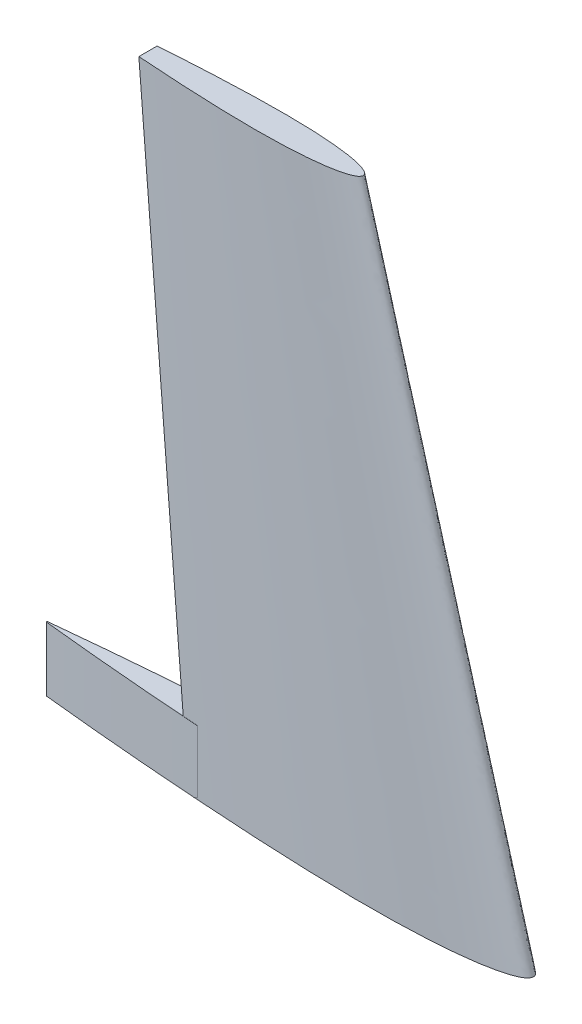
ISO-10303-21;
HEADER;
FILE_DESCRIPTION(('STEP AP214'),'2;1');
FILE_NAME('part.step','',(''),(''),'','','');
FILE_SCHEMA(('AUTOMOTIVE_DESIGN { 1 0 10303 214 1 1 1 1 }'));
ENDSEC;
DATA;
#1=APPLICATION_CONTEXT('core data for automotive mechanical design processes');
#2=APPLICATION_PROTOCOL_DEFINITION('international standard','automotive_design',2000,#1);
#3=PRODUCT_CONTEXT('',#1,'mechanical');
#4=PRODUCT('Part','Part','',(#3));
#5=PRODUCT_RELATED_PRODUCT_CATEGORY('part','',(#4));
#6=PRODUCT_DEFINITION_FORMATION('','',#4);
#7=PRODUCT_DEFINITION_CONTEXT('part definition',#1,'design');
#8=PRODUCT_DEFINITION('design','',#6,#7);
#9=PRODUCT_DEFINITION_SHAPE('','',#8);
#10=(LENGTH_UNIT() NAMED_UNIT(*) SI_UNIT(.MILLI.,.METRE.));
#11=(NAMED_UNIT(*) PLANE_ANGLE_UNIT() SI_UNIT($,.RADIAN.));
#12=(NAMED_UNIT(*) SI_UNIT($,.STERADIAN.) SOLID_ANGLE_UNIT());
#13=UNCERTAINTY_MEASURE_WITH_UNIT(LENGTH_MEASURE(1.E-05),#10,'distance_accuracy_value','');
#14=(GEOMETRIC_REPRESENTATION_CONTEXT(3) GLOBAL_UNCERTAINTY_ASSIGNED_CONTEXT((#13)) GLOBAL_UNIT_ASSIGNED_CONTEXT((#10,
#11,#12)) REPRESENTATION_CONTEXT('',''));
#15=CARTESIAN_POINT('',(0.,0.,0.));
#16=DIRECTION('',(0.,0.,1.));
#17=DIRECTION('',(1.,0.,0.));
#18=AXIS2_PLACEMENT_3D('',#15,#16,#17);
#19=CARTESIAN_POINT('',(-107.720324003647,-9.65174103072676,0.));
#20=DIRECTION('',(0.996009928689521,0.0892424896105811,0.));
#21=DIRECTION('',(-0.0892424896105811,0.996009928689521,0.));
#22=AXIS2_PLACEMENT_3D('',#19,#20,#21);
#23=PLANE('',#22);
#24=DIRECTION('',(0.,0.,-1.));
#25=VECTOR('',#24,1.);
#26=CARTESIAN_POINT('',(-110.46672,21.,0.));
#27=LINE('',#26,#25);
#28=CARTESIAN_POINT('',(-110.46672,21.,4.44269398266289));
#29=VERTEX_POINT('',#28);
#30=CARTESIAN_POINT('',(-110.46672,21.,-4.44269398266289));
#31=VERTEX_POINT('',#30);
#32=EDGE_CURVE('E135',#29,#31,#27,.T.);
#33=ORIENTED_EDGE('',*,*,#32,.F.);
#34=DIRECTION('',(-0.0892395941244988,0.995977612996639,-0.00805538639746426));
#35=VECTOR('',#34,1.);
#36=CARTESIAN_POINT('',(-108.58512,0.,4.61254028456699));
#37=LINE('',#36,#35);
#38=CARTESIAN_POINT('',(-126.469728,199.605,2.99815118496854));
#39=VERTEX_POINT('',#38);
#40=EDGE_CURVE('E147',#29,#39,#37,.T.);
#41=ORIENTED_EDGE('',*,*,#40,.T.);
#42=DIRECTION('',(0.,0.,1.));
#43=VECTOR('',#42,1.);
#44=CARTESIAN_POINT('',(-126.469728,199.605,-2.99815118496854));
#45=LINE('',#44,#43);
#46=CARTESIAN_POINT('',(-126.469728,199.605,-2.99815118496854));
#47=VERTEX_POINT('',#46);
#48=EDGE_CURVE('E155',#47,#39,#45,.T.);
#49=ORIENTED_EDGE('',*,*,#48,.F.);
#50=DIRECTION('',(-0.0892395941244988,0.995977612996639,0.00805538639746426));
#51=VECTOR('',#50,1.);
#52=CARTESIAN_POINT('',(-108.58512,0.,-4.61254028456699));
#53=LINE('',#52,#51);
#54=EDGE_CURVE('E148',#31,#47,#53,.T.);
#55=ORIENTED_EDGE('',*,*,#54,.F.);
#56=EDGE_LOOP('',(#33,#41,#49,#55));
#57=FACE_BOUND('',#56,.T.);
#58=ADVANCED_FACE('F41',(#57),#23,.F.);
#59=CARTESIAN_POINT('',(-108.58512,0.,4.61254028456699));
#60=CARTESIAN_POINT('',(-126.469728,199.605,2.99815118496854));
#61=CARTESIAN_POINT('',(-107.228332137767,0.,4.70955705234458));
#62=CARTESIAN_POINT('',(-125.587815889549,199.605,3.06121208402398));
#63=CARTESIAN_POINT('',(-103.181889975605,0.,4.99889686035702));
#64=CARTESIAN_POINT('',(-122.957628484143,199.605,3.24928295923207));
#65=CARTESIAN_POINT('',(-96.3829650975476,0.,5.43702829368455));
#66=CARTESIAN_POINT('',(-118.538327313406,199.605,3.53406839089496));
#67=CARTESIAN_POINT('',(-88.1589881656291,0.,5.92332409272216));
#68=CARTESIAN_POINT('',(-113.192742307659,199.605,3.8501606602694));
#69=CARTESIAN_POINT('',(-79.8436853018367,0.,6.35199189562285));
#70=CARTESIAN_POINT('',(-107.787795446194,199.605,4.12879473215486));
#71=CARTESIAN_POINT('',(-71.528310822155,0.,6.71019173242817));
#72=CARTESIAN_POINT('',(-102.382802034401,199.605,4.36162462607831));
#73=CARTESIAN_POINT('',(-63.303851699423,0.,6.98163734497177));
#74=CARTESIAN_POINT('',(-97.0369036046249,199.605,4.53806427423165));
#75=CARTESIAN_POINT('',(-55.2603589198151,0.,7.15196515713389));
#76=CARTESIAN_POINT('',(-91.8086332978798,199.605,4.64877735213703));
#77=CARTESIAN_POINT('',(-47.4858758734645,0.,7.20843252660261));
#78=CARTESIAN_POINT('',(-86.7552193177519,199.605,4.68548114229169));
#79=CARTESIAN_POINT('',(-40.0654989124777,0.,7.14119852076718));
#80=CARTESIAN_POINT('',(-81.9319742931105,199.605,4.64177903849867));
#81=CARTESIAN_POINT('',(-33.0804131006898,0.,6.94411512745219));
#82=CARTESIAN_POINT('',(-77.3916685154484,199.605,4.51367483284393));
#83=CARTESIAN_POINT('',(-26.6070147545383,0.,6.61530365960141));
#84=CARTESIAN_POINT('',(-73.1839595904498,199.605,4.29994737874092));
#85=CARTESIAN_POINT('',(-20.7158529227579,0.,6.15765106741228));
#86=CARTESIAN_POINT('',(-69.3547043997927,199.605,4.00247319381798));
#87=CARTESIAN_POINT('',(-15.4711789361699,0.,5.57799094735985));
#88=CARTESIAN_POINT('',(-65.9456663085104,199.605,3.6256941157839));
#89=CARTESIAN_POINT('',(-10.9284005760381,0.,4.88885263676656));
#90=CARTESIAN_POINT('',(-62.9928603744248,199.605,3.17775421389826));
#91=CARTESIAN_POINT('',(-7.13711014927592,0.,4.10096521897535));
#92=CARTESIAN_POINT('',(-60.5285215970293,199.605,2.66562739233397));
#93=CARTESIAN_POINT('',(-4.12506326308165,0.,3.24140730448498));
#94=CARTESIAN_POINT('',(-58.5706911210031,199.605,2.10691474791524));
#95=CARTESIAN_POINT('',(-1.92448513538529,0.,2.29767487532008));
#96=CARTESIAN_POINT('',(-57.1403153380004,199.605,1.49348866895805));
#97=CARTESIAN_POINT('',(-0.458501504664714,0.,1.32267961655571));
#98=CARTESIAN_POINT('',(-56.1874259780321,199.605,0.859741750761209));
#99=CARTESIAN_POINT('',(0.18955706489082,0.,0.));
#100=CARTESIAN_POINT('',(-55.766187907821,199.605,0.));
#101=CARTESIAN_POINT('',(-0.458501504664706,0.,-1.32267961655569));
#102=CARTESIAN_POINT('',(-56.1874259780321,199.605,-0.859741750761206));
#103=CARTESIAN_POINT('',(-1.92448513538531,0.,-2.29767487532009));
#104=CARTESIAN_POINT('',(-57.1403153380004,199.605,-1.49348866895806));
#105=CARTESIAN_POINT('',(-4.12506326308164,0.,-3.24140730448497));
#106=CARTESIAN_POINT('',(-58.5706911210031,199.605,-2.10691474791523));
#107=CARTESIAN_POINT('',(-7.13711014927592,0.,-4.10096521897535));
#108=CARTESIAN_POINT('',(-60.5285215970293,199.605,-2.66562739233398));
#109=CARTESIAN_POINT('',(-10.9284005760381,0.,-4.88885263676656));
#110=CARTESIAN_POINT('',(-62.9928603744248,199.605,-3.17775421389826));
#111=CARTESIAN_POINT('',(-15.4711789361699,0.,-5.57799094735985));
#112=CARTESIAN_POINT('',(-65.9456663085104,199.605,-3.62569411578391));
#113=CARTESIAN_POINT('',(-20.7158529227579,0.,-6.15765106741228));
#114=CARTESIAN_POINT('',(-69.3547043997926,199.605,-4.00247319381798));
#115=CARTESIAN_POINT('',(-26.6070147545383,0.,-6.61530365960141));
#116=CARTESIAN_POINT('',(-73.1839595904499,199.605,-4.29994737874092));
#117=CARTESIAN_POINT('',(-33.0804131006898,0.,-6.94411512745219));
#118=CARTESIAN_POINT('',(-77.3916685154483,199.605,-4.51367483284392));
#119=CARTESIAN_POINT('',(-40.0654989124777,0.,-7.14119852076718));
#120=CARTESIAN_POINT('',(-81.9319742931105,199.605,-4.64177903849867));
#121=CARTESIAN_POINT('',(-47.4858758734644,0.,-7.20843252660261));
#122=CARTESIAN_POINT('',(-86.7552193177519,199.605,-4.68548114229169));
#123=CARTESIAN_POINT('',(-55.2603589198151,0.,-7.15196515713389));
#124=CARTESIAN_POINT('',(-91.8086332978798,199.605,-4.64877735213703));
#125=CARTESIAN_POINT('',(-63.303851699423,0.,-6.98163734497176));
#126=CARTESIAN_POINT('',(-97.0369036046249,199.605,-4.53806427423165));
#127=CARTESIAN_POINT('',(-71.528310822155,0.,-6.71019173242818));
#128=CARTESIAN_POINT('',(-102.382802034401,199.605,-4.36162462607831));
#129=CARTESIAN_POINT('',(-79.8436853018367,0.,-6.35199189562285));
#130=CARTESIAN_POINT('',(-107.787795446194,199.605,-4.12879473215486));
#131=CARTESIAN_POINT('',(-88.1589881656291,0.,-5.92332409272216));
#132=CARTESIAN_POINT('',(-113.192742307659,199.605,-3.8501606602694));
#133=CARTESIAN_POINT('',(-96.3829650975476,0.,-5.43702829368455));
#134=CARTESIAN_POINT('',(-118.538327313406,199.605,-3.53406839089496));
#135=CARTESIAN_POINT('',(-103.181889975605,0.,-4.99889686035702));
#136=CARTESIAN_POINT('',(-122.957628484143,199.605,-3.24928295923207));
#137=CARTESIAN_POINT('',(-107.228332137767,0.,-4.70955705234458));
#138=CARTESIAN_POINT('',(-125.587815889549,199.605,-3.06121208402398));
#139=CARTESIAN_POINT('',(-108.58512,0.,-4.61254028456699));
#140=CARTESIAN_POINT('',(-126.469728,199.605,-2.99815118496854));
#141=B_SPLINE_SURFACE_WITH_KNOTS('',3,1,((#59,#60),(#61,#62),(#63,#64),(#65,#66),(#67,#68),(#69,
#70),(#71,#72),(#73,#74),(#75,#76),(#77,#78),(#79,#80),(#81,#82),(#83,#84),(#85,#86),(#87,#88),
(#89,#90),(#91,#92),(#93,#94),(#95,#96),(#97,#98),(#99,#100),(#101,#102),(#103,#104),(#105,
#106),(#107,#108),(#109,#110),(#111,#112),(#113,#114),(#115,#116),(#117,#118),(#119,#120),(#121,
#122),(#123,#124),(#125,#126),(#127,#128),(#129,#130),(#131,#132),(#133,#134),(#135,#136),(#137,
#138),(#139,#140)),.UNSPECIFIED.,.F.,.F.,.F.,(4,1,1,1,1,1,1,1,1,1,1,1,1,1,1,1,1,1,1,1,1,1,1,1,1,
1,1,1,1,1,1,1,1,1,1,1,1,1,4),(2,2),(0.,0.0184991990313922,0.0551714391103743,0.0926551947459053,
0.130538861378944,0.168407204268983,0.205846371784387,0.242448967142613,0.277819055280114,
0.31157698184847,0.343363918285861,0.372846133093968,0.399719140493533,0.423712132827816,
0.44459359078009,0.462180115204489,0.476353861047873,0.487105624794223,0.494669112548725,0.5,
0.505330887451276,0.512894375205777,0.523646138952127,0.537819884795511,0.55540640921991,
0.576287867172184,0.600280859506467,0.627153866906032,0.656636081714139,0.68842301815153,
0.722180944719886,0.757551032857387,0.794153628215613,0.831592795731017,0.869461138621057,
0.907344805254095,0.944828560889626,0.981500800968608,1.),(0.,1.),.UNSPECIFIED.);
#142=CARTESIAN_POINT('',(-105.39144,21.,4.79898087083141));
#143=CARTESIAN_POINT('',(-105.39144,20.0104558290474,4.80099678784214));
#144=CARTESIAN_POINT('',(-105.39144,19.0209116233288,4.80299572319709));
#145=CARTESIAN_POINT('',(-105.39144,14.0731904196294,4.81290741378728));
#146=CARTESIAN_POINT('',(-105.39144,10.1150129202369,4.82057121041995));
#147=CARTESIAN_POINT('',(-105.39144,4.28219717559921,4.8315095963079));
#148=CARTESIAN_POINT('',(-105.39144,2.40755927877034,4.83497109114485));
#149=CARTESIAN_POINT('',(-105.39144,0.532921290290838,4.8383811519729));
#150=B_SPLINE_CURVE_WITH_KNOTS('',3,(#142,#143,#144,#145,#146,#147,#148,#149),.UNSPECIFIED.,.F.,
.F.,(4,2,2,4),(0.,2.9686386735317,14.8431933915654,20.4671166651781),.UNSPECIFIED.);
#151=CARTESIAN_POINT('',(-105.39144,21.,4.79898087083141));
#152=VERTEX_POINT('',#151);
#153=CARTESIAN_POINT('',(-105.39144,0.532921290290839,4.8383811519729));
#154=VERTEX_POINT('',#153);
#155=EDGE_CURVE('E54',#152,#154,#150,.T.);
#156=CARTESIAN_POINT('',(-105.39144,0.532921290290839,4.8383811519729));
#157=CARTESIAN_POINT('',(-105.432944401496,0.525607984436195,4.83548919505617));
#158=CARTESIAN_POINT('',(-105.474204046523,0.516969895242272,4.83261428926946));
#159=CARTESIAN_POINT('',(-105.55605616476,0.497303250874179,4.82691088561784));
#160=CARTESIAN_POINT('',(-105.596649932305,0.486280128448196,4.82408229774514));
#161=CARTESIAN_POINT('',(-105.67715733747,0.462074373415193,4.81847236026226));
#162=CARTESIAN_POINT('',(-105.717071353358,0.448892988281466,4.81569098438257));
#163=CARTESIAN_POINT('',(-105.874057859138,0.392770806805327,4.80475106017644));
#164=CARTESIAN_POINT('',(-105.988484352046,0.342289281954734,4.7967760175077));
#165=CARTESIAN_POINT('',(-106.183121672297,0.243976029210729,4.78320768371535));
#166=CARTESIAN_POINT('',(-106.264680591067,0.19868982306474,4.77752117706903));
#167=CARTESIAN_POINT('',(-106.385209710447,0.126938962586684,4.76911580353139));
#168=CARTESIAN_POINT('',(-106.425250062229,0.102272492550254,4.76632319525848));
#169=CARTESIAN_POINT('',(-106.50466278355,0.0518848830484817,4.76078391442978));
#170=CARTESIAN_POINT('',(-106.544035188007,0.0261637989556034,4.75803723947289));
#171=CARTESIAN_POINT('',(-106.583106675311,0.,4.75531120496791));
#172=B_SPLINE_CURVE_WITH_KNOTS('',3,(#156,#157,#158,#159,#160,#161,#162,#163,#164,#165,#166,
#167,#168,#169,#170,#171),.UNSPECIFIED.,.F.,.F.,(4,2,2,2,2,2,2,4),(0.,0.126690283826035,
0.253094968540876,0.379426847752399,0.754231125284098,1.0344616195037,1.17577788855759,
1.31708674728475),.UNSPECIFIED.);
#173=CARTESIAN_POINT('',(-106.583100155156,0.,4.75531166745253));
#174=VERTEX_POINT('',#173);
#175=EDGE_CURVE('E11',#154,#174,#172,.T.);
#176=CARTESIAN_POINT('',(-108.58512,0.,4.61254028456699));
#177=CARTESIAN_POINT('',(-107.228332137767,0.,4.70955705234458));
#178=CARTESIAN_POINT('',(-103.181889975605,0.,4.99889686035702));
#179=CARTESIAN_POINT('',(-96.3829650975476,0.,5.43702829368455));
#180=CARTESIAN_POINT('',(-88.1589881656291,0.,5.92332409272216));
#181=CARTESIAN_POINT('',(-79.8436853018367,0.,6.35199189562285));
#182=CARTESIAN_POINT('',(-71.528310822155,0.,6.71019173242817));
#183=CARTESIAN_POINT('',(-63.303851699423,0.,6.98163734497177));
#184=CARTESIAN_POINT('',(-55.2603589198151,0.,7.15196515713389));
#185=CARTESIAN_POINT('',(-47.4858758734645,0.,7.20843252660261));
#186=CARTESIAN_POINT('',(-40.0654989124777,0.,7.14119852076718));
#187=CARTESIAN_POINT('',(-33.0804131006898,0.,6.94411512745219));
#188=CARTESIAN_POINT('',(-26.6070147545383,0.,6.61530365960141));
#189=CARTESIAN_POINT('',(-20.7158529227579,0.,6.15765106741228));
#190=CARTESIAN_POINT('',(-15.4711789361699,0.,5.57799094735985));
#191=CARTESIAN_POINT('',(-10.9284005760381,0.,4.88885263676656));
#192=CARTESIAN_POINT('',(-7.13711014927592,0.,4.10096521897535));
#193=CARTESIAN_POINT('',(-4.12506326308165,0.,3.24140730448498));
#194=CARTESIAN_POINT('',(-1.92448513538529,0.,2.29767487532008));
#195=CARTESIAN_POINT('',(-0.458501504664714,0.,1.32267961655571));
#196=CARTESIAN_POINT('',(0.18955706489082,0.,0.));
#197=CARTESIAN_POINT('',(-0.458501504664706,0.,-1.32267961655569));
#198=CARTESIAN_POINT('',(-1.92448513538531,0.,-2.29767487532009));
#199=CARTESIAN_POINT('',(-4.12506326308164,0.,-3.24140730448497));
#200=CARTESIAN_POINT('',(-7.13711014927592,0.,-4.10096521897535));
#201=CARTESIAN_POINT('',(-10.9284005760381,0.,-4.88885263676656));
#202=CARTESIAN_POINT('',(-15.4711789361699,0.,-5.57799094735985));
#203=CARTESIAN_POINT('',(-20.7158529227579,0.,-6.15765106741228));
#204=CARTESIAN_POINT('',(-26.6070147545383,0.,-6.61530365960141));
#205=CARTESIAN_POINT('',(-33.0804131006898,0.,-6.94411512745219));
#206=CARTESIAN_POINT('',(-40.0654989124777,0.,-7.14119852076718));
#207=CARTESIAN_POINT('',(-47.4858758734644,0.,-7.20843252660261));
#208=CARTESIAN_POINT('',(-55.2603589198151,0.,-7.15196515713389));
#209=CARTESIAN_POINT('',(-63.303851699423,0.,-6.98163734497176));
#210=CARTESIAN_POINT('',(-71.528310822155,0.,-6.71019173242818));
#211=CARTESIAN_POINT('',(-79.8436853018367,0.,-6.35199189562285));
#212=CARTESIAN_POINT('',(-88.1589881656291,0.,-5.92332409272216));
#213=CARTESIAN_POINT('',(-96.3829650975476,0.,-5.43702829368455));
#214=CARTESIAN_POINT('',(-103.181889975605,0.,-4.99889686035702));
#215=CARTESIAN_POINT('',(-107.228332137767,0.,-4.70955705234458));
#216=CARTESIAN_POINT('',(-108.58512,0.,-4.61254028456699));
#217=B_SPLINE_CURVE_WITH_KNOTS('',3,(#176,#177,#178,#179,#180,#181,#182,#183,#184,#185,#186,
#187,#188,#189,#190,#191,#192,#193,#194,#195,#196,#197,#198,#199,#200,#201,#202,#203,#204,#205,
#206,#207,#208,#209,#210,#211,#212,#213,#214,#215,#216),.UNSPECIFIED.,.F.,.F.,(4,1,1,1,1,1,1,1,
1,1,1,1,1,1,1,1,1,1,1,1,1,1,1,1,1,1,1,1,1,1,1,1,1,1,1,1,1,1,4),(0.,0.0184991990313922,
0.0551714391103743,0.0926551947459053,0.130538861378944,0.168407204268983,0.205846371784387,
0.242448967142613,0.277819055280114,0.31157698184847,0.343363918285861,0.372846133093968,
0.399719140493533,0.423712132827816,0.44459359078009,0.462180115204489,0.476353861047873,
0.487105624794223,0.494669112548725,0.5,0.505330887451276,0.512894375205777,0.523646138952127,
0.537819884795511,0.55540640921991,0.576287867172184,0.600280859506467,0.627153866906032,
0.656636081714139,0.68842301815153,0.722180944719886,0.757551032857387,0.794153628215613,
0.831592795731017,0.869461138621057,0.907344805254095,0.944828560889626,0.981500800968608,1.),.UNSPECIFIED.);
#218=CARTESIAN_POINT('',(-106.583100155159,0.,-4.75531166745228));
#219=VERTEX_POINT('',#218);
#220=EDGE_CURVE('E138',#174,#219,#217,.T.);
#221=CARTESIAN_POINT('',(-106.583106673987,0.,-4.75531120506101));
#222=CARTESIAN_POINT('',(-106.533441638236,0.0332510086964409,-4.75877635676567));
#223=CARTESIAN_POINT('',(-106.483289941522,0.0657974146908599,-4.76227488885281));
#224=CARTESIAN_POINT('',(-106.381619153129,0.129271792153078,-4.76936628643841));
#225=CARTESIAN_POINT('',(-106.330094325373,0.16019050992195,-4.77295954661814));
#226=CARTESIAN_POINT('',(-106.225700629455,0.219901969177385,-4.78023884676319));
#227=CARTESIAN_POINT('',(-106.172829502043,0.248690770367267,-4.78392504256668));
#228=CARTESIAN_POINT('',(-106.066880526446,0.303016686949354,-4.79131103175201));
#229=CARTESIAN_POINT('',(-106.013831862747,0.328610648752177,-4.79500880800258));
#230=CARTESIAN_POINT('',(-105.906451405224,0.376704385584744,-4.80249315310966));
#231=CARTESIAN_POINT('',(-105.852121857782,0.39920916493762,-4.80627956644453));
#232=CARTESIAN_POINT('',(-105.742160592971,0.440568222698776,-4.81394265998234));
#233=CARTESIAN_POINT('',(-105.68653065636,0.459427199069466,-4.81781921670841));
#234=CARTESIAN_POINT('',(-105.591126953773,0.487803557392013,-4.82446714302638));
#235=CARTESIAN_POINT('',(-105.551677662993,0.498417480176309,-4.82721597900534));
#236=CARTESIAN_POINT('',(-105.472045755549,0.517420572565027,-4.8327646751896));
#237=CARTESIAN_POINT('',(-105.431860483134,0.525798521137264,-4.83556472008308));
#238=CARTESIAN_POINT('',(-105.39144,0.53292129029124,-4.83838115197287));
#239=B_SPLINE_CURVE_WITH_KNOTS('',3,(#221,#222,#223,#224,#225,#226,#227,#228,#229,#230,#231,
#232,#233,#234,#235,#236,#237,#238),.UNSPECIFIED.,.F.,.F.,(4,2,2,2,2,2,2,2,4),(0.,
0.179621257805113,0.3601726698953,0.541050152825999,0.718016924711397,0.894693547847969,
1.07114096629666,1.19391249884235,1.31728903302698),.UNSPECIFIED.);
#240=CARTESIAN_POINT('',(-105.39144,0.53292129028974,-4.8383811519729));
#241=VERTEX_POINT('',#240);
#242=EDGE_CURVE('E194',#219,#241,#239,.T.);
#243=CARTESIAN_POINT('',(-105.39144,0.53292129028974,-4.8383811519729));
#244=CARTESIAN_POINT('',(-105.39144,1.52246587445126,-4.83657961119998));
#245=CARTESIAN_POINT('',(-105.39144,2.5120104341366,-4.83476435617928));
#246=CARTESIAN_POINT('',(-105.39144,7.45973310913185,-4.82561672150773));
#247=CARTESIAN_POINT('',(-105.39144,11.4179108326533,-4.81807026319179));
#248=CARTESIAN_POINT('',(-105.39144,17.2507254764588,-4.80656062312601));
#249=CARTESIAN_POINT('',(-105.39144,19.1253628024784,-4.8028022559712));
#250=CARTESIAN_POINT('',(-105.39144,21.,-4.79898087083141));
#251=B_SPLINE_CURVE_WITH_KNOTS('',3,(#243,#244,#245,#246,#247,#248,#249,#250),.UNSPECIFIED.,.F.,
.F.,(4,2,2,4),(0.,2.96863867338242,14.8431933884061,20.4671166653306),.UNSPECIFIED.);
#252=CARTESIAN_POINT('',(-105.39144,21.,-4.79898087083141));
#253=VERTEX_POINT('',#252);
#254=EDGE_CURVE('E172',#241,#253,#251,.T.);
#255=CARTESIAN_POINT('',(-105.39144,21.,-4.79898087083141));
#256=CARTESIAN_POINT('',(-105.638261117956,21.,-4.78225538808619));
#257=CARTESIAN_POINT('',(-105.885074688933,21.,-4.76541863485909));
#258=CARTESIAN_POINT('',(-106.378687075154,21.,-4.73153127890645));
#259=CARTESIAN_POINT('',(-106.625485890402,21.,-4.71448067624632));
#260=CARTESIAN_POINT('',(-107.365860481874,21.,-4.66302114744226));
#261=CARTESIAN_POINT('',(-107.859414858381,21.,-4.62830446964039));
#262=CARTESIAN_POINT('',(-108.705258395558,21.,-4.56840344478572));
#263=CARTESIAN_POINT('',(-109.05755574912,21.,-4.54333421181175));
#264=CARTESIAN_POINT('',(-109.7621420989,21.,-4.49307501619232));
#265=CARTESIAN_POINT('',(-110.114431095112,21.,-4.46788505346243));
#266=CARTESIAN_POINT('',(-110.46672,21.,-4.44269398266289));
#267=B_SPLINE_CURVE_WITH_KNOTS('',3,(#255,#256,#257,#258,#259,#260,#261,#262,#263,#264,#265,
#266),.UNSPECIFIED.,.F.,.F.,(4,2,2,2,2,4),(0.,0.742161440190204,1.48432265336781,
2.96864371293188,4.02820825455292,5.08777353733586),.UNSPECIFIED.);
#268=EDGE_CURVE('E158',#253,#31,#267,.T.);
#269=CARTESIAN_POINT('',(-126.469728,199.605,2.99815118496854));
#270=CARTESIAN_POINT('',(-125.587815889549,199.605,3.06121208402398));
#271=CARTESIAN_POINT('',(-122.957628484143,199.605,3.24928295923207));
#272=CARTESIAN_POINT('',(-118.538327313406,199.605,3.53406839089496));
#273=CARTESIAN_POINT('',(-113.192742307659,199.605,3.8501606602694));
#274=CARTESIAN_POINT('',(-107.787795446194,199.605,4.12879473215486));
#275=CARTESIAN_POINT('',(-102.382802034401,199.605,4.36162462607831));
#276=CARTESIAN_POINT('',(-97.0369036046249,199.605,4.53806427423165));
#277=CARTESIAN_POINT('',(-91.8086332978798,199.605,4.64877735213703));
#278=CARTESIAN_POINT('',(-86.7552193177519,199.605,4.68548114229169));
#279=CARTESIAN_POINT('',(-81.9319742931105,199.605,4.64177903849867));
#280=CARTESIAN_POINT('',(-77.3916685154484,199.605,4.51367483284393));
#281=CARTESIAN_POINT('',(-73.1839595904498,199.605,4.29994737874092));
#282=CARTESIAN_POINT('',(-69.3547043997927,199.605,4.00247319381798));
#283=CARTESIAN_POINT('',(-65.9456663085104,199.605,3.6256941157839));
#284=CARTESIAN_POINT('',(-62.9928603744248,199.605,3.17775421389826));
#285=CARTESIAN_POINT('',(-60.5285215970293,199.605,2.66562739233397));
#286=CARTESIAN_POINT('',(-58.5706911210031,199.605,2.10691474791524));
#287=CARTESIAN_POINT('',(-57.1403153380004,199.605,1.49348866895805));
#288=CARTESIAN_POINT('',(-56.1874259780321,199.605,0.859741750761209));
#289=CARTESIAN_POINT('',(-55.766187907821,199.605,0.));
#290=CARTESIAN_POINT('',(-56.1874259780321,199.605,-0.859741750761206));
#291=CARTESIAN_POINT('',(-57.1403153380004,199.605,-1.49348866895806));
#292=CARTESIAN_POINT('',(-58.5706911210031,199.605,-2.10691474791523));
#293=CARTESIAN_POINT('',(-60.5285215970293,199.605,-2.66562739233398));
#294=CARTESIAN_POINT('',(-62.9928603744248,199.605,-3.17775421389826));
#295=CARTESIAN_POINT('',(-65.9456663085104,199.605,-3.62569411578391));
#296=CARTESIAN_POINT('',(-69.3547043997926,199.605,-4.00247319381798));
#297=CARTESIAN_POINT('',(-73.1839595904499,199.605,-4.29994737874092));
#298=CARTESIAN_POINT('',(-77.3916685154483,199.605,-4.51367483284392));
#299=CARTESIAN_POINT('',(-81.9319742931105,199.605,-4.64177903849867));
#300=CARTESIAN_POINT('',(-86.7552193177519,199.605,-4.68548114229169));
#301=CARTESIAN_POINT('',(-91.8086332978798,199.605,-4.64877735213703));
#302=CARTESIAN_POINT('',(-97.0369036046249,199.605,-4.53806427423165));
#303=CARTESIAN_POINT('',(-102.382802034401,199.605,-4.36162462607831));
#304=CARTESIAN_POINT('',(-107.787795446194,199.605,-4.12879473215486));
#305=CARTESIAN_POINT('',(-113.192742307659,199.605,-3.8501606602694));
#306=CARTESIAN_POINT('',(-118.538327313406,199.605,-3.53406839089496));
#307=CARTESIAN_POINT('',(-122.957628484143,199.605,-3.24928295923207));
#308=CARTESIAN_POINT('',(-125.587815889549,199.605,-3.06121208402398));
#309=CARTESIAN_POINT('',(-126.469728,199.605,-2.99815118496854));
#310=B_SPLINE_CURVE_WITH_KNOTS('',3,(#269,#270,#271,#272,#273,#274,#275,#276,#277,#278,#279,
#280,#281,#282,#283,#284,#285,#286,#287,#288,#289,#290,#291,#292,#293,#294,#295,#296,#297,#298,
#299,#300,#301,#302,#303,#304,#305,#306,#307,#308,#309),.UNSPECIFIED.,.F.,.F.,(4,1,1,1,1,1,1,1,
1,1,1,1,1,1,1,1,1,1,1,1,1,1,1,1,1,1,1,1,1,1,1,1,1,1,1,1,1,1,4),(0.,0.0184991990313921,
0.0551714391103741,0.0926551947459051,0.130538861378943,0.168407204268983,0.205846371784387,
0.242448967142613,0.277819055280114,0.31157698184847,0.343363918285861,0.372846133093968,
0.399719140493533,0.423712132827816,0.44459359078009,0.462180115204489,0.476353861047873,
0.487105624794223,0.494669112548724,0.5,0.505330887451276,0.512894375205777,0.523646138952127,
0.537819884795511,0.55540640921991,0.576287867172184,0.600280859506467,0.627153866906032,
0.656636081714139,0.68842301815153,0.722180944719886,0.757551032857387,0.794153628215613,
0.831592795731017,0.869461138621057,0.907344805254095,0.944828560889626,0.981500800968608,1.),.UNSPECIFIED.);
#311=EDGE_CURVE('E153',#39,#47,#310,.T.);
#312=CARTESIAN_POINT('',(-110.46672,21.,4.44269398266289));
#313=CARTESIAN_POINT('',(-109.973206381445,21.,4.47797818110242));
#314=CARTESIAN_POINT('',(-109.479692984366,21.,4.51326891315021));
#315=CARTESIAN_POINT('',(-108.492643208893,21.,4.58351847172322));
#316=CARTESIAN_POINT('',(-107.999106830528,21.,4.61847729865119));
#317=CARTESIAN_POINT('',(-107.153223423386,21.,4.67781119490409));
#318=CARTESIAN_POINT('',(-106.800888067694,21.,4.70235222412823));
#319=CARTESIAN_POINT('',(-106.096187586648,21.,4.75100731170746));
#320=CARTESIAN_POINT('',(-105.743822461268,21.,4.77512136969265));
#321=CARTESIAN_POINT('',(-105.39144,21.,4.79898087083141));
#322=B_SPLINE_CURVE_WITH_KNOTS('',3,(#312,#313,#314,#315,#316,#317,#318,#319,#320,#321),
.UNSPECIFIED.,.F.,.F.,(4,2,2,2,4),(0.,1.48432047027486,2.96863913920792,4.02820586420493,
5.08777350710781),.UNSPECIFIED.);
#323=EDGE_CURVE('E64',#29,#152,#322,.T.);
#324=ORIENTED_EDGE('',*,*,#155,.T.);
#325=ORIENTED_EDGE('',*,*,#175,.T.);
#326=ORIENTED_EDGE('',*,*,#220,.T.);
#327=ORIENTED_EDGE('',*,*,#242,.T.);
#328=ORIENTED_EDGE('',*,*,#254,.T.);
#329=ORIENTED_EDGE('',*,*,#268,.T.);
#330=ORIENTED_EDGE('',*,*,#54,.T.);
#331=ORIENTED_EDGE('',*,*,#311,.F.);
#332=ORIENTED_EDGE('',*,*,#40,.F.);
#333=ORIENTED_EDGE('',*,*,#323,.T.);
#334=EDGE_LOOP('',(#324,#325,#326,#327,#328,#329,#330,#331,#332,#333));
#335=FACE_BOUND('',#334,.T.);
#336=ADVANCED_FACE('F179',(#335),#141,.T.);
#337=CARTESIAN_POINT('',(-55.8894,199.605,0.));
#338=DIRECTION('',(0.,1.,0.));
#339=DIRECTION('',(0.,0.,1.));
#340=AXIS2_PLACEMENT_3D('',#337,#338,#339);
#341=PLANE('',#340);
#342=ORIENTED_EDGE('',*,*,#311,.T.);
#343=ORIENTED_EDGE('',*,*,#48,.T.);
#344=EDGE_LOOP('',(#342,#343));
#345=FACE_BOUND('',#344,.T.);
#346=ADVANCED_FACE('F43',(#345),#341,.T.);
#347=CARTESIAN_POINT('',(0.,0.,0.));
#348=DIRECTION('',(0.,1.,0.));
#349=DIRECTION('',(0.,0.,1.));
#350=AXIS2_PLACEMENT_3D('',#347,#348,#349);
#351=PLANE('',#350);
#352=ORIENTED_EDGE('',*,*,#220,.F.);
#353=CARTESIAN_POINT('',(-159.684,0.,0.150901379999997));
#354=CARTESIAN_POINT('',(-159.538206740955,0.,0.166227397576564));
#355=CARTESIAN_POINT('',(-158.956662871091,0.,0.22736020734771));
#356=CARTESIAN_POINT('',(-157.654167735613,0.,0.363232864906859));
#357=CARTESIAN_POINT('',(-155.499199595112,0.,0.585135084939033));
#358=CARTESIAN_POINT('',(-152.515342824684,0.,0.886382639002947));
#359=CARTESIAN_POINT('',(-148.735276644178,0.,1.25843710642803));
#360=CARTESIAN_POINT('',(-144.200400510749,0.,1.69122324290008));
#361=CARTESIAN_POINT('',(-138.960393443252,0.,2.17372631258149));
#362=CARTESIAN_POINT('',(-133.072661112903,0.,2.69426684651439));
#363=CARTESIAN_POINT('',(-126.601733984542,0.,3.24114577556316));
#364=CARTESIAN_POINT('',(-119.61844236826,0.,3.80104901824076));
#365=CARTESIAN_POINT('',(-112.491801686009,0.,4.34363959839497));
#366=CARTESIAN_POINT('',(-107.700021020603,0.,4.67752301386645));
#367=CARTESIAN_POINT('',(-105.39144,0.,4.8383811519729));
#368=B_SPLINE_CURVE_WITH_KNOTS('',3,(#353,#354,#355,#356,#357,#358,#359,#360,#361,#362,#363,
#364,#365,#366,#367),.UNSPECIFIED.,.F.,.F.,(4,1,1,1,1,1,1,1,1,1,1,1,4),(0.,0.00806992419661279,
0.0321895194439435,0.0720894725721876,0.127324923855723,0.197281241513437,0.281181722650915,
0.378096945041151,0.486955528822678,0.60655613462991,0.735580601250078,0.872608191388973,1.),.UNSPECIFIED.);
#369=CARTESIAN_POINT('',(-159.684,0.,0.150901379999997));
#370=VERTEX_POINT('',#369);
#371=EDGE_CURVE('E128',#370,#174,#368,.T.);
#372=ORIENTED_EDGE('',*,*,#371,.F.);
#373=DIRECTION('',(0.,0.,1.));
#374=VECTOR('',#373,1.);
#375=CARTESIAN_POINT('',(-159.684,0.,-0.150901379999997));
#376=LINE('',#375,#374);
#377=CARTESIAN_POINT('',(-159.684,0.,-0.150901379999997));
#378=VERTEX_POINT('',#377);
#379=EDGE_CURVE('E256',#378,#370,#376,.T.);
#380=ORIENTED_EDGE('',*,*,#379,.F.);
#381=CARTESIAN_POINT('',(-105.39144,0.,-4.8383811519729));
#382=CARTESIAN_POINT('',(-107.700021020603,0.,-4.67752301386645));
#383=CARTESIAN_POINT('',(-112.491801686009,0.,-4.34363959839497));
#384=CARTESIAN_POINT('',(-119.61844236826,0.,-3.80104901824076));
#385=CARTESIAN_POINT('',(-126.601733984542,0.,-3.24114577556316));
#386=CARTESIAN_POINT('',(-133.072661112903,0.,-2.69426684651439));
#387=CARTESIAN_POINT('',(-138.960393443252,0.,-2.17372631258149));
#388=CARTESIAN_POINT('',(-144.200400510749,0.,-1.69122324290008));
#389=CARTESIAN_POINT('',(-148.735276644178,0.,-1.25843710642803));
#390=CARTESIAN_POINT('',(-152.515342824684,0.,-0.886382639002947));
#391=CARTESIAN_POINT('',(-155.499199595112,0.,-0.585135084939033));
#392=CARTESIAN_POINT('',(-157.654167735613,0.,-0.363232864906859));
#393=CARTESIAN_POINT('',(-158.956662871091,0.,-0.22736020734771));
#394=CARTESIAN_POINT('',(-159.538206740955,0.,-0.166227397576564));
#395=CARTESIAN_POINT('',(-159.684,0.,-0.150901379999997));
#396=B_SPLINE_CURVE_WITH_KNOTS('',3,(#381,#382,#383,#384,#385,#386,#387,#388,#389,#390,#391,
#392,#393,#394,#395),.UNSPECIFIED.,.F.,.F.,(4,1,1,1,1,1,1,1,1,1,1,1,4),(0.,0.127391808611027,
0.264419398749922,0.39344386537009,0.513044471177322,0.621903054958849,0.718818277349085,
0.802718758486563,0.872675076144277,0.927910527427812,0.967810480556056,0.991930075803387,1.),.UNSPECIFIED.);
#397=EDGE_CURVE('E133',#219,#378,#396,.T.);
#398=ORIENTED_EDGE('',*,*,#397,.F.);
#399=EDGE_LOOP('',(#352,#372,#380,#398));
#400=FACE_BOUND('',#399,.T.);
#401=ADVANCED_FACE('F209',(#400),#351,.F.);
#402=CARTESIAN_POINT('',(-105.39144,21.,-4.8383811519729));
#403=DIRECTION('',(-1.,0.,0.));
#404=DIRECTION('',(0.,0.,1.));
#405=AXIS2_PLACEMENT_3D('',#402,#403,#404);
#406=PLANE('',#405);
#407=ORIENTED_EDGE('',*,*,#155,.F.);
#408=DIRECTION('',(0.,0.,-1.));
#409=VECTOR('',#408,1.);
#410=CARTESIAN_POINT('',(-105.39144,21.,-4.8383811519729));
#411=LINE('',#410,#409);
#412=CARTESIAN_POINT('',(-105.39144,21.,4.8383811519729));
#413=VERTEX_POINT('',#412);
#414=EDGE_CURVE('E221',#413,#152,#411,.T.);
#415=ORIENTED_EDGE('',*,*,#414,.F.);
#416=DIRECTION('',(0.,-1.,0.));
#417=VECTOR('',#416,1.);
#418=CARTESIAN_POINT('',(-105.39144,21.,4.8383811519729));
#419=LINE('',#418,#417);
#420=EDGE_CURVE('E140',#413,#154,#419,.T.);
#421=ORIENTED_EDGE('',*,*,#420,.T.);
#422=EDGE_LOOP('',(#407,#415,#421));
#423=FACE_BOUND('',#422,.T.);
#424=ADVANCED_FACE('F208',(#423),#406,.F.);
#425=CARTESIAN_POINT('',(-105.39144,21.,-4.8383811519729));
#426=CARTESIAN_POINT('',(-107.700021020603,21.,-4.67752301386645));
#427=CARTESIAN_POINT('',(-112.491801686009,21.,-4.34363959839497));
#428=CARTESIAN_POINT('',(-119.61844236826,21.,-3.80104901824076));
#429=CARTESIAN_POINT('',(-126.601733984542,21.,-3.24114577556316));
#430=CARTESIAN_POINT('',(-133.072661112903,21.,-2.69426684651439));
#431=CARTESIAN_POINT('',(-138.960393443252,21.,-2.17372631258149));
#432=CARTESIAN_POINT('',(-144.200400510749,21.,-1.69122324290008));
#433=CARTESIAN_POINT('',(-148.735276644178,21.,-1.25843710642803));
#434=CARTESIAN_POINT('',(-152.515342824684,21.,-0.886382639002947));
#435=CARTESIAN_POINT('',(-155.499199595112,21.,-0.585135084939033));
#436=CARTESIAN_POINT('',(-157.654167735613,21.,-0.363232864906859));
#437=CARTESIAN_POINT('',(-158.956662871091,21.,-0.22736020734771));
#438=CARTESIAN_POINT('',(-159.538206740955,21.,-0.166227397576564));
#439=CARTESIAN_POINT('',(-159.684,21.,-0.150901379999997));
#440=B_SPLINE_CURVE_WITH_KNOTS('',3,(#425,#426,#427,#428,#429,#430,#431,#432,#433,#434,#435,
#436,#437,#438,#439),.UNSPECIFIED.,.F.,.F.,(4,1,1,1,1,1,1,1,1,1,1,1,4),(0.,0.127391808611027,
0.264419398749922,0.39344386537009,0.513044471177322,0.621903054958849,0.718818277349085,
0.802718758486563,0.872675076144277,0.927910527427812,0.967810480556056,0.991930075803387,1.),.UNSPECIFIED.);
#441=DIRECTION('',(0.,-1.,0.));
#442=VECTOR('',#441,1.);
#443=SURFACE_OF_LINEAR_EXTRUSION('',#440,#442);
#444=ORIENTED_EDGE('',*,*,#242,.F.);
#445=ORIENTED_EDGE('',*,*,#397,.T.);
#446=DIRECTION('',(0.,-1.,0.));
#447=VECTOR('',#446,1.);
#448=CARTESIAN_POINT('',(-159.684,21.,-0.150901379999997));
#449=LINE('',#448,#447);
#450=CARTESIAN_POINT('',(-159.684,21.,-0.150901379999997));
#451=VERTEX_POINT('',#450);
#452=EDGE_CURVE('E112',#451,#378,#449,.T.);
#453=ORIENTED_EDGE('',*,*,#452,.F.);
#454=CARTESIAN_POINT('',(-105.39144,21.,-4.8383811519729));
#455=VERTEX_POINT('',#454);
#456=EDGE_CURVE('E118',#455,#451,#440,.T.);
#457=ORIENTED_EDGE('',*,*,#456,.F.);
#458=DIRECTION('',(0.,-1.,0.));
#459=VECTOR('',#458,1.);
#460=CARTESIAN_POINT('',(-105.39144,21.,-4.8383811519729));
#461=LINE('',#460,#459);
#462=EDGE_CURVE('E249',#455,#241,#461,.T.);
#463=ORIENTED_EDGE('',*,*,#462,.T.);
#464=EDGE_LOOP('',(#444,#445,#453,#457,#463));
#465=FACE_BOUND('',#464,.T.);
#466=ADVANCED_FACE('F131',(#465),#443,.F.);
#467=CARTESIAN_POINT('',(-159.684,21.,-0.150901379999997));
#468=DIRECTION('',(1.,0.,0.));
#469=DIRECTION('',(0.,0.,-1.));
#470=AXIS2_PLACEMENT_3D('',#467,#468,#469);
#471=PLANE('',#470);
#472=ORIENTED_EDGE('',*,*,#379,.T.);
#473=DIRECTION('',(0.,-1.,0.));
#474=VECTOR('',#473,1.);
#475=CARTESIAN_POINT('',(-159.684,21.,0.150901379999997));
#476=LINE('',#475,#474);
#477=CARTESIAN_POINT('',(-159.684,21.,0.150901379999997));
#478=VERTEX_POINT('',#477);
#479=EDGE_CURVE('E114',#478,#370,#476,.T.);
#480=ORIENTED_EDGE('',*,*,#479,.F.);
#481=DIRECTION('',(0.,0.,1.));
#482=VECTOR('',#481,1.);
#483=CARTESIAN_POINT('',(-159.684,21.,-0.150901379999997));
#484=LINE('',#483,#482);
#485=EDGE_CURVE('E108',#451,#478,#484,.T.);
#486=ORIENTED_EDGE('',*,*,#485,.F.);
#487=ORIENTED_EDGE('',*,*,#452,.T.);
#488=EDGE_LOOP('',(#472,#480,#486,#487));
#489=FACE_BOUND('',#488,.T.);
#490=ADVANCED_FACE('F110',(#489),#471,.F.);
#491=CARTESIAN_POINT('',(-159.684,21.,0.150901379999997));
#492=CARTESIAN_POINT('',(-159.538206740955,21.,0.166227397576564));
#493=CARTESIAN_POINT('',(-158.956662871091,21.,0.22736020734771));
#494=CARTESIAN_POINT('',(-157.654167735613,21.,0.363232864906859));
#495=CARTESIAN_POINT('',(-155.499199595112,21.,0.585135084939033));
#496=CARTESIAN_POINT('',(-152.515342824684,21.,0.886382639002947));
#497=CARTESIAN_POINT('',(-148.735276644178,21.,1.25843710642803));
#498=CARTESIAN_POINT('',(-144.200400510749,21.,1.69122324290008));
#499=CARTESIAN_POINT('',(-138.960393443252,21.,2.17372631258149));
#500=CARTESIAN_POINT('',(-133.072661112903,21.,2.69426684651439));
#501=CARTESIAN_POINT('',(-126.601733984542,21.,3.24114577556316));
#502=CARTESIAN_POINT('',(-119.61844236826,21.,3.80104901824076));
#503=CARTESIAN_POINT('',(-112.491801686009,21.,4.34363959839497));
#504=CARTESIAN_POINT('',(-107.700021020603,21.,4.67752301386645));
#505=CARTESIAN_POINT('',(-105.39144,21.,4.8383811519729));
#506=B_SPLINE_CURVE_WITH_KNOTS('',3,(#491,#492,#493,#494,#495,#496,#497,#498,#499,#500,#501,
#502,#503,#504,#505),.UNSPECIFIED.,.F.,.F.,(4,1,1,1,1,1,1,1,1,1,1,1,4),(0.,0.00806992419661279,
0.0321895194439435,0.0720894725721876,0.127324923855723,0.197281241513437,0.281181722650915,
0.378096945041151,0.486955528822678,0.60655613462991,0.735580601250078,0.872608191388973,1.),.UNSPECIFIED.);
#507=DIRECTION('',(0.,-1.,0.));
#508=VECTOR('',#507,1.);
#509=SURFACE_OF_LINEAR_EXTRUSION('',#506,#508);
#510=ORIENTED_EDGE('',*,*,#175,.F.);
#511=ORIENTED_EDGE('',*,*,#420,.F.);
#512=EDGE_CURVE('E117',#478,#413,#506,.T.);
#513=ORIENTED_EDGE('',*,*,#512,.F.);
#514=ORIENTED_EDGE('',*,*,#479,.T.);
#515=ORIENTED_EDGE('',*,*,#371,.T.);
#516=EDGE_LOOP('',(#510,#511,#513,#514,#515));
#517=FACE_BOUND('',#516,.T.);
#518=ADVANCED_FACE('F226',(#517),#509,.F.);
#519=ORIENTED_EDGE('',*,*,#254,.F.);
#520=ORIENTED_EDGE('',*,*,#462,.F.);
#521=EDGE_CURVE('E124',#253,#455,#411,.T.);
#522=ORIENTED_EDGE('',*,*,#521,.F.);
#523=EDGE_LOOP('',(#519,#520,#522));
#524=FACE_BOUND('',#523,.T.);
#525=ADVANCED_FACE('F186',(#524),#406,.F.);
#526=CARTESIAN_POINT('',(-132.558470119813,21.,-2.73459387546047));
#527=DIRECTION('',(0.,-1.,0.));
#528=DIRECTION('',(0.,0.,-1.));
#529=AXIS2_PLACEMENT_3D('',#526,#527,#528);
#530=PLANE('',#529);
#531=ORIENTED_EDGE('',*,*,#323,.F.);
#532=ORIENTED_EDGE('',*,*,#32,.T.);
#533=ORIENTED_EDGE('',*,*,#268,.F.);
#534=ORIENTED_EDGE('',*,*,#521,.T.);
#535=ORIENTED_EDGE('',*,*,#456,.T.);
#536=ORIENTED_EDGE('',*,*,#485,.T.);
#537=ORIENTED_EDGE('',*,*,#512,.T.);
#538=ORIENTED_EDGE('',*,*,#414,.T.);
#539=EDGE_LOOP('',(#531,#532,#533,#534,#535,#536,#537,#538));
#540=FACE_BOUND('',#539,.T.);
#541=ADVANCED_FACE('F121',(#540),#530,.F.);
#542=CLOSED_SHELL('',(#58,#336,#346,#401,#424,#466,#490,#518,#525,#541));
#543=MANIFOLD_SOLID_BREP('B2',#542);
#544=ADVANCED_BREP_SHAPE_REPRESENTATION('',(#18,#543),#14);
#545=SHAPE_DEFINITION_REPRESENTATION(#9,#544);
ENDSEC;
END-ISO-10303-21;
